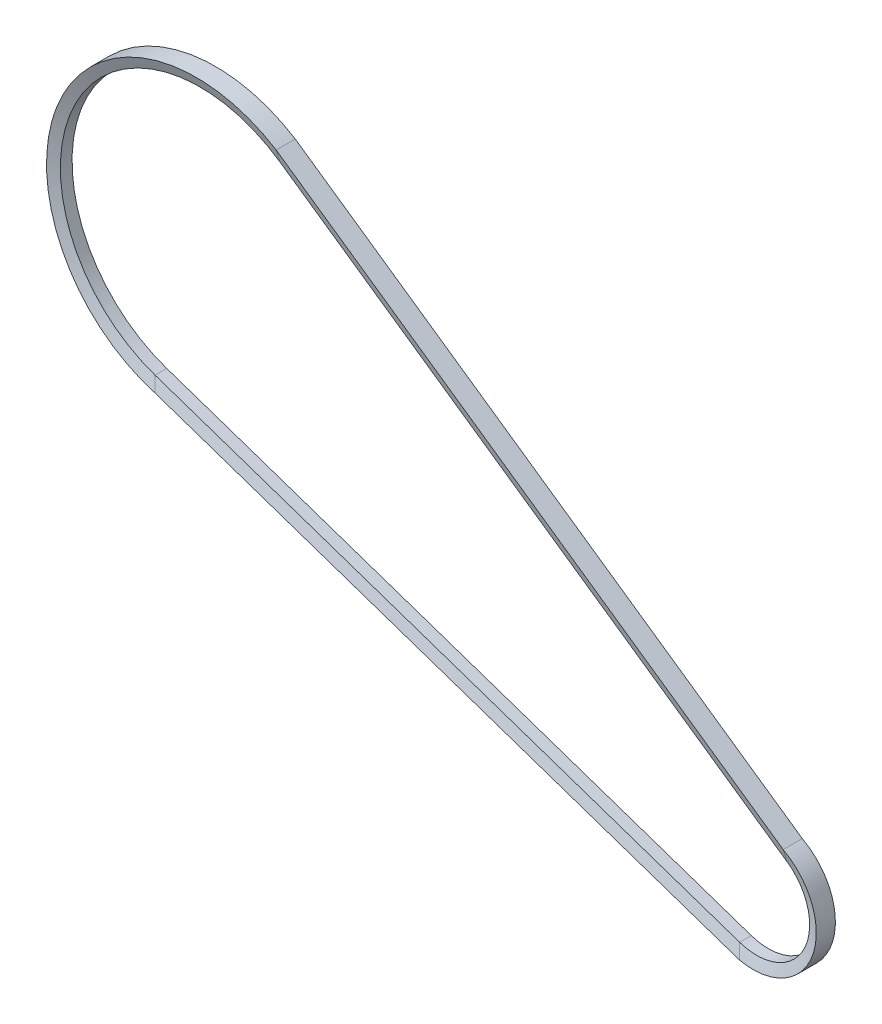
ISO-10303-21;
HEADER;
FILE_DESCRIPTION(('STEP AP214'),'2;1');
FILE_NAME('part.step','',(''),(''),'','','');
FILE_SCHEMA(('AUTOMOTIVE_DESIGN { 1 0 10303 214 1 1 1 1 }'));
ENDSEC;
DATA;
#1=APPLICATION_CONTEXT('core data for automotive mechanical design processes');
#2=APPLICATION_PROTOCOL_DEFINITION('international standard','automotive_design',2000,#1);
#3=PRODUCT_CONTEXT('',#1,'mechanical');
#4=PRODUCT('Part','Part','',(#3));
#5=PRODUCT_RELATED_PRODUCT_CATEGORY('part','',(#4));
#6=PRODUCT_DEFINITION_FORMATION('','',#4);
#7=PRODUCT_DEFINITION_CONTEXT('part definition',#1,'design');
#8=PRODUCT_DEFINITION('design','',#6,#7);
#9=PRODUCT_DEFINITION_SHAPE('','',#8);
#10=(LENGTH_UNIT() NAMED_UNIT(*) SI_UNIT(.MILLI.,.METRE.));
#11=(NAMED_UNIT(*) PLANE_ANGLE_UNIT() SI_UNIT($,.RADIAN.));
#12=(NAMED_UNIT(*) SI_UNIT($,.STERADIAN.) SOLID_ANGLE_UNIT());
#13=UNCERTAINTY_MEASURE_WITH_UNIT(LENGTH_MEASURE(1.E-05),#10,'distance_accuracy_value','');
#14=(GEOMETRIC_REPRESENTATION_CONTEXT(3) GLOBAL_UNCERTAINTY_ASSIGNED_CONTEXT((#13)) GLOBAL_UNIT_ASSIGNED_CONTEXT((#10,
#11,#12)) REPRESENTATION_CONTEXT('',''));
#15=CARTESIAN_POINT('',(0.,0.,0.));
#16=DIRECTION('',(0.,0.,1.));
#17=DIRECTION('',(1.,0.,0.));
#18=AXIS2_PLACEMENT_3D('',#15,#16,#17);
#19=CARTESIAN_POINT('',(1.20237153566904E-09,-7.0921046813055E-10,0.));
#20=DIRECTION('',(0.,0.,-1.));
#21=DIRECTION('',(-1.,0.,0.));
#22=AXIS2_PLACEMENT_3D('',#19,#20,#21);
#23=CYLINDRICAL_SURFACE('',#22,172.680901298834);
#24=CARTESIAN_POINT('',(1.20237153566904E-09,-7.0921046813055E-10,-11.));
#25=DIRECTION('',(0.,0.,-1.));
#26=DIRECTION('',(-0.277978977666814,-0.960587157927542,0.));
#27=AXIS2_PLACEMENT_3D('',#24,#25,#26);
#28=CIRCLE('',#27,172.680901298834);
#29=CARTESIAN_POINT('',(-48.0016604044897,-165.875056207894,-11.));
#30=VERTEX_POINT('',#29);
#31=CARTESIAN_POINT('',(91.8760151979489,146.21043569063,-11.));
#32=VERTEX_POINT('',#31);
#33=EDGE_CURVE('E11',#30,#32,#28,.T.);
#34=ORIENTED_EDGE('',*,*,#33,.F.);
#35=DIRECTION('',(0.,0.,1.));
#36=VECTOR('',#35,1.);
#37=CARTESIAN_POINT('',(-48.0016604044317,-165.875056207723,-11.));
#38=LINE('',#37,#36);
#39=CARTESIAN_POINT('',(-48.0016604044897,-165.875056207894,11.));
#40=VERTEX_POINT('',#39);
#41=EDGE_CURVE('E42',#30,#40,#38,.T.);
#42=ORIENTED_EDGE('',*,*,#41,.T.);
#43=CARTESIAN_POINT('',(1.20237153566904E-09,-7.0921046813055E-10,11.));
#44=DIRECTION('',(0.,0.,-1.));
#45=DIRECTION('',(-0.277978977666814,-0.960587157927542,0.));
#46=AXIS2_PLACEMENT_3D('',#43,#44,#45);
#47=CIRCLE('',#46,172.680901298834);
#48=CARTESIAN_POINT('',(91.8760151979489,146.21043569063,11.));
#49=VERTEX_POINT('',#48);
#50=EDGE_CURVE('E124',#40,#49,#47,.T.);
#51=ORIENTED_EDGE('',*,*,#50,.T.);
#52=DIRECTION('',(0.,0.,1.));
#53=VECTOR('',#52,1.);
#54=CARTESIAN_POINT('',(91.8760151979489,146.21043569063,-11.));
#55=LINE('',#54,#53);
#56=EDGE_CURVE('E127',#32,#49,#55,.T.);
#57=ORIENTED_EDGE('',*,*,#56,.F.);
#58=EDGE_LOOP('',(#34,#42,#51,#57));
#59=FACE_BOUND('',#58,.T.);
#60=ADVANCED_FACE('F39',(#59),#23,.T.);
#61=CARTESIAN_POINT('',(-51.8615264868886,-152.418443997054,-6.72));
#62=CARTESIAN_POINT('',(-151.368037812326,-118.560602140557,-6.72));
#63=CARTESIAN_POINT('',(-191.095266275028,-21.2484930789851,-6.72));
#64=CARTESIAN_POINT('',(-143.714287609072,72.5755023166236,-6.72));
#65=CARTESIAN_POINT('',(-96.3333089431168,166.399497712232,-6.72));
#66=CARTESIAN_POINT('',(5.56182919919446,192.192521464756,-6.72));
#67=CARTESIAN_POINT('',(91.8760152001114,132.211186481796,-6.72));
#68=CARTESIAN_POINT('',(-48.0016604044317,-165.875056207723,-11.));
#69=CARTESIAN_POINT('',(-156.293332503292,-134.537131219409,-11.));
#70=CARTESIAN_POINT('',(-203.685844075398,-32.2478275976319,-11.));
#71=CARTESIAN_POINT('',(-157.577213818633,70.6265910125611,-11.));
#72=CARTESIAN_POINT('',(-111.468583561867,173.501009622754,-11.));
#73=CARTESIAN_POINT('',(-3.57759260075846,206.191770671868,-11.));
#74=CARTESIAN_POINT('',(91.8760152001114,146.210435688908,-11.));
#75=(BOUNDED_SURFACE() B_SPLINE_SURFACE(1,3,((#61,#62,#63,#64,#65,#66,#67),(#68,#69,#70,#71,#72,
#73,#74)),.UNSPECIFIED.,.F.,.F.,.F.) B_SPLINE_SURFACE_WITH_KNOTS((2,2),(4,3,4),(0.,1.),(0.,0.5,
1.),.UNSPECIFIED.) GEOMETRIC_REPRESENTATION_ITEM() RATIONAL_B_SPLINE_SURFACE(((1.,
0.77069526935344,0.77069526935344,1.,0.77069526935344,0.77069526935344,1.),(1.,0.77069526935344,
0.77069526935344,1.,0.77069526935344,0.77069526935344,1.))) REPRESENTATION_ITEM('') SURFACE());
#76=CARTESIAN_POINT('',(1.20237153566904E-09,-7.0921046813055E-10,-6.72));
#77=DIRECTION('',(0.,0.,-1.));
#78=DIRECTION('',(-0.322121282535088,-0.946698409916247,0.));
#79=AXIS2_PLACEMENT_3D('',#76,#77,#78);
#80=CIRCLE('',#79,160.99999999982);
#81=CARTESIAN_POINT('',(-51.8615264869466,-152.418443997225,-6.72));
#82=VERTEX_POINT('',#81);
#83=CARTESIAN_POINT('',(91.8760151979489,132.211186483518,-6.72));
#84=VERTEX_POINT('',#83);
#85=EDGE_CURVE('E47',#82,#84,#80,.T.);
#86=DIRECTION('',(0.263671875357343,-0.919236600893949,-0.292371704722741));
#87=VECTOR('',#86,1.);
#88=CARTESIAN_POINT('',(-51.8615264868887,-152.418443997054,-6.72));
#89=LINE('',#88,#87);
#90=EDGE_CURVE('E193',#82,#30,#89,.T.);
#91=DIRECTION('',(0.,0.956304755963034,-0.292371704722741));
#92=VECTOR('',#91,1.);
#93=CARTESIAN_POINT('',(91.8760151979489,132.211186483518,-6.72));
#94=LINE('',#93,#92);
#95=EDGE_CURVE('E152',#84,#32,#94,.T.);
#96=ORIENTED_EDGE('',*,*,#85,.F.);
#97=ORIENTED_EDGE('',*,*,#90,.T.);
#98=ORIENTED_EDGE('',*,*,#33,.T.);
#99=ORIENTED_EDGE('',*,*,#95,.F.);
#100=EDGE_LOOP('',(#96,#97,#98,#99));
#101=FACE_BOUND('',#100,.T.);
#102=ADVANCED_FACE('F233',(#101),#75,.T.);
#103=CARTESIAN_POINT('',(1.20237153566904E-09,-7.0921046813055E-10,0.));
#104=DIRECTION('',(0.,0.,-1.));
#105=DIRECTION('',(-1.,0.,0.));
#106=AXIS2_PLACEMENT_3D('',#103,#104,#105);
#107=CYLINDRICAL_SURFACE('',#106,160.99999999982);
#108=CARTESIAN_POINT('',(1.20237153566904E-09,-7.0921046813055E-10,6.72));
#109=DIRECTION('',(0.,0.,-1.));
#110=DIRECTION('',(-0.322121282535088,-0.946698409916247,0.));
#111=AXIS2_PLACEMENT_3D('',#108,#109,#110);
#112=CIRCLE('',#111,160.99999999982);
#113=CARTESIAN_POINT('',(-51.8615264869466,-152.418443997225,6.72));
#114=VERTEX_POINT('',#113);
#115=CARTESIAN_POINT('',(91.8760151979489,132.211186483518,6.72));
#116=VERTEX_POINT('',#115);
#117=EDGE_CURVE('E133',#114,#116,#112,.T.);
#118=ORIENTED_EDGE('',*,*,#117,.F.);
#119=DIRECTION('',(0.,0.,-1.));
#120=VECTOR('',#119,1.);
#121=CARTESIAN_POINT('',(-51.8615264868887,-152.418443997054,6.72));
#122=LINE('',#121,#120);
#123=EDGE_CURVE('E177',#114,#82,#122,.T.);
#124=ORIENTED_EDGE('',*,*,#123,.T.);
#125=ORIENTED_EDGE('',*,*,#85,.T.);
#126=DIRECTION('',(0.,0.,-1.));
#127=VECTOR('',#126,1.);
#128=CARTESIAN_POINT('',(91.8760151979489,132.211186483518,6.72));
#129=LINE('',#128,#127);
#130=EDGE_CURVE('E157',#116,#84,#129,.T.);
#131=ORIENTED_EDGE('',*,*,#130,.F.);
#132=EDGE_LOOP('',(#118,#124,#125,#131));
#133=FACE_BOUND('',#132,.T.);
#134=ADVANCED_FACE('F229',(#133),#107,.F.);
#135=CARTESIAN_POINT('',(625.400467857975,-395.005215225236,-11.));
#136=DIRECTION('',(-0.322121282518866,-0.946698409921766,0.));
#137=DIRECTION('',(0.946698409921767,-0.322121282518866,0.));
#138=AXIS2_PLACEMENT_3D('',#135,#136,#137);
#139=PLANE('',#138);
#140=ORIENTED_EDGE('',*,*,#41,.F.);
#141=DIRECTION('',(-0.946698409921766,0.322121282518866,0.));
#142=VECTOR('',#141,1.);
#143=CARTESIAN_POINT('',(625.400467857975,-395.005215225236,-11.));
#144=LINE('',#143,#142);
#145=CARTESIAN_POINT('',(625.400467857975,-395.005215225236,-11.));
#146=VERTEX_POINT('',#145);
#147=EDGE_CURVE('E55',#146,#30,#144,.T.);
#148=ORIENTED_EDGE('',*,*,#147,.F.);
#149=DIRECTION('',(0.,0.,1.));
#150=VECTOR('',#149,1.);
#151=CARTESIAN_POINT('',(625.400467857975,-395.005215225236,-11.));
#152=LINE('',#151,#150);
#153=CARTESIAN_POINT('',(625.400467857975,-395.005215225236,11.));
#154=VERTEX_POINT('',#153);
#155=EDGE_CURVE('E181',#146,#154,#152,.T.);
#156=ORIENTED_EDGE('',*,*,#155,.T.);
#157=DIRECTION('',(-0.946698409921766,0.322121282518866,0.));
#158=VECTOR('',#157,1.);
#159=CARTESIAN_POINT('',(625.400467857975,-395.005215225236,11.));
#160=LINE('',#159,#158);
#161=EDGE_CURVE('E179',#154,#40,#160,.T.);
#162=ORIENTED_EDGE('',*,*,#161,.T.);
#163=EDGE_LOOP('',(#140,#148,#156,#162));
#164=FACE_BOUND('',#163,.T.);
#165=ADVANCED_FACE('F208',(#164),#139,.T.);
#166=CARTESIAN_POINT('',(621.540601775518,-381.548603014567,-6.72));
#167=DIRECTION('',(0.112390264031447,0.330309389734367,-0.937157476416985));
#168=DIRECTION('',(0.,0.943133032697069,0.332415527067598));
#169=AXIS2_PLACEMENT_3D('',#166,#167,#168);
#170=PLANE('',#169);
#171=ORIENTED_EDGE('',*,*,#147,.T.);
#172=ORIENTED_EDGE('',*,*,#90,.F.);
#173=DIRECTION('',(-0.946698409921766,0.322121282518866,0.));
#174=VECTOR('',#173,1.);
#175=CARTESIAN_POINT('',(621.540601775518,-381.548603014567,-6.72));
#176=LINE('',#175,#174);
#177=CARTESIAN_POINT('',(621.540601775518,-381.548603014567,-6.72));
#178=VERTEX_POINT('',#177);
#179=EDGE_CURVE('E64',#178,#82,#176,.T.);
#180=ORIENTED_EDGE('',*,*,#179,.F.);
#181=DIRECTION('',(0.263671875357343,-0.919236600893949,-0.292371704722741));
#182=VECTOR('',#181,1.);
#183=CARTESIAN_POINT('',(621.540601775518,-381.548603014567,-6.72));
#184=LINE('',#183,#182);
#185=EDGE_CURVE('E190',#178,#146,#184,.T.);
#186=ORIENTED_EDGE('',*,*,#185,.T.);
#187=EDGE_LOOP('',(#171,#172,#180,#186));
#188=FACE_BOUND('',#187,.T.);
#189=ADVANCED_FACE('F219',(#188),#170,.T.);
#190=CARTESIAN_POINT('',(621.540601775518,-381.548603014567,6.72));
#191=DIRECTION('',(0.322121282518866,0.946698409921766,0.));
#192=DIRECTION('',(-0.946698409921767,0.322121282518866,0.));
#193=AXIS2_PLACEMENT_3D('',#190,#191,#192);
#194=PLANE('',#193);
#195=ORIENTED_EDGE('',*,*,#179,.T.);
#196=ORIENTED_EDGE('',*,*,#123,.F.);
#197=DIRECTION('',(-0.946698409921766,0.322121282518866,0.));
#198=VECTOR('',#197,1.);
#199=CARTESIAN_POINT('',(621.540601775518,-381.548603014567,6.72));
#200=LINE('',#199,#198);
#201=CARTESIAN_POINT('',(621.540601775518,-381.548603014567,6.72));
#202=VERTEX_POINT('',#201);
#203=EDGE_CURVE('E92',#202,#114,#200,.T.);
#204=ORIENTED_EDGE('',*,*,#203,.F.);
#205=DIRECTION('',(0.,0.,-1.));
#206=VECTOR('',#205,1.);
#207=CARTESIAN_POINT('',(621.540601775518,-381.548603014567,6.72));
#208=LINE('',#207,#206);
#209=EDGE_CURVE('E171',#202,#178,#208,.T.);
#210=ORIENTED_EDGE('',*,*,#209,.T.);
#211=EDGE_LOOP('',(#195,#196,#204,#210));
#212=FACE_BOUND('',#211,.T.);
#213=ADVANCED_FACE('F221',(#212),#194,.T.);
#214=CARTESIAN_POINT('',(625.400467857975,-395.005215225236,11.));
#215=DIRECTION('',(0.112390264031447,0.330309389734368,0.937157476416985));
#216=DIRECTION('',(0.,-0.943133032697069,0.332415527067598));
#217=AXIS2_PLACEMENT_3D('',#214,#215,#216);
#218=PLANE('',#217);
#219=ORIENTED_EDGE('',*,*,#203,.T.);
#220=DIRECTION('',(-0.263671875357343,0.919236600893948,-0.292371704722741));
#221=VECTOR('',#220,1.);
#222=CARTESIAN_POINT('',(-48.0016604044317,-165.875056207723,11.));
#223=LINE('',#222,#221);
#224=EDGE_CURVE('E175',#40,#114,#223,.T.);
#225=ORIENTED_EDGE('',*,*,#224,.F.);
#226=ORIENTED_EDGE('',*,*,#161,.F.);
#227=DIRECTION('',(-0.263671875357342,0.919236600893948,-0.292371704722741));
#228=VECTOR('',#227,1.);
#229=CARTESIAN_POINT('',(625.400467857975,-395.005215225236,11.));
#230=LINE('',#229,#228);
#231=EDGE_CURVE('E166',#154,#202,#230,.T.);
#232=ORIENTED_EDGE('',*,*,#231,.T.);
#233=EDGE_LOOP('',(#219,#225,#226,#232));
#234=FACE_BOUND('',#233,.T.);
#235=ADVANCED_FACE('F227',(#234),#218,.T.);
#236=CARTESIAN_POINT('',(641.190000009169,-323.800000009339,0.));
#237=DIRECTION('',(0.,0.,-1.));
#238=DIRECTION('',(-1.,0.,0.));
#239=AXIS2_PLACEMENT_3D('',#236,#237,#238);
#240=CYLINDRICAL_SURFACE('',#239,72.934847634692);
#241=ORIENTED_EDGE('',*,*,#155,.F.);
#242=CARTESIAN_POINT('',(641.190000009169,-323.800000009339,-11.));
#243=DIRECTION('',(0.,0.,-1.));
#244=DIRECTION('',(0.477277575498753,0.878752590850253,0.));
#245=AXIS2_PLACEMENT_3D('',#242,#243,#244);
#246=CIRCLE('',#245,72.934847634692);
#247=CARTESIAN_POINT('',(676.000167257626,-259.708313687085,-11.));
#248=VERTEX_POINT('',#247);
#249=EDGE_CURVE('E200',#248,#146,#246,.T.);
#250=ORIENTED_EDGE('',*,*,#249,.F.);
#251=DIRECTION('',(0.,0.,1.));
#252=VECTOR('',#251,1.);
#253=CARTESIAN_POINT('',(676.000167257626,-259.708313687085,-11.));
#254=LINE('',#253,#252);
#255=CARTESIAN_POINT('',(676.000167257626,-259.708313687085,11.));
#256=VERTEX_POINT('',#255);
#257=EDGE_CURVE('E174',#248,#256,#254,.T.);
#258=ORIENTED_EDGE('',*,*,#257,.T.);
#259=CARTESIAN_POINT('',(641.190000009169,-323.800000009339,11.));
#260=DIRECTION('',(0.,0.,-1.));
#261=DIRECTION('',(0.477277575498753,0.878752590850253,0.));
#262=AXIS2_PLACEMENT_3D('',#259,#260,#261);
#263=CIRCLE('',#262,72.934847634692);
#264=EDGE_CURVE('E169',#256,#154,#263,.T.);
#265=ORIENTED_EDGE('',*,*,#264,.T.);
#266=EDGE_LOOP('',(#241,#250,#258,#265));
#267=FACE_BOUND('',#266,.T.);
#268=ADVANCED_FACE('F213',(#267),#240,.T.);
#269=CARTESIAN_POINT('',(676.000167257626,-273.707562894197,-6.72));
#270=CARTESIAN_POINT('',(753.602555687789,-327.634907533556,-6.72));
#271=CARTESIAN_POINT('',(711.003797814672,-411.989131005683,-6.72));
#272=CARTESIAN_POINT('',(621.540601775518,-381.548603014567,-6.72));
#273=CARTESIAN_POINT('',(676.000167257626,-259.708313687085,-11.));
#274=CARTESIAN_POINT('',(775.289964751233,-313.635658326444,-11.));
#275=CARTESIAN_POINT('',(735.710428555955,-419.466101492578,-11.));
#276=CARTESIAN_POINT('',(625.400467857975,-395.005215225236,-11.));
#277=(BOUNDED_SURFACE() B_SPLINE_SURFACE(1,3,((#269,#270,#271,#272),(#273,#274,#275,#276)),
.UNSPECIFIED.,.F.,.F.,.F.) B_SPLINE_SURFACE_WITH_KNOTS((2,2),(4,4),(0.,1.),(0.,1.),
.UNSPECIFIED.) GEOMETRIC_REPRESENTATION_ITEM() RATIONAL_B_SPLINE_SURFACE(((1.,0.426143610762231,
0.426143610762231,1.),(1.,0.426143610762231,0.426143610762231,1.))) REPRESENTATION_ITEM('') SURFACE());
#278=CARTESIAN_POINT('',(641.190000009169,-323.800000009339,-6.72));
#279=DIRECTION('',(0.,0.,-1.));
#280=DIRECTION('',(0.570658479482897,0.821187493690855,0.));
#281=AXIS2_PLACEMENT_3D('',#278,#279,#280);
#282=CIRCLE('',#281,61.);
#283=CARTESIAN_POINT('',(676.000167257626,-273.707562894197,-6.72));
#284=VERTEX_POINT('',#283);
#285=EDGE_CURVE('E105',#284,#178,#282,.T.);
#286=DIRECTION('',(0.,0.956304755963034,-0.292371704722741));
#287=VECTOR('',#286,1.);
#288=CARTESIAN_POINT('',(676.000167257626,-273.707562894197,-6.72));
#289=LINE('',#288,#287);
#290=EDGE_CURVE('E187',#284,#248,#289,.T.);
#291=ORIENTED_EDGE('',*,*,#249,.T.);
#292=ORIENTED_EDGE('',*,*,#185,.F.);
#293=ORIENTED_EDGE('',*,*,#285,.F.);
#294=ORIENTED_EDGE('',*,*,#290,.T.);
#295=EDGE_LOOP('',(#291,#292,#293,#294));
#296=FACE_BOUND('',#295,.T.);
#297=ADVANCED_FACE('F218',(#296),#277,.T.);
#298=CARTESIAN_POINT('',(641.190000009169,-323.800000009339,0.));
#299=DIRECTION('',(0.,0.,-1.));
#300=DIRECTION('',(-1.,0.,0.));
#301=AXIS2_PLACEMENT_3D('',#298,#299,#300);
#302=CYLINDRICAL_SURFACE('',#301,61.);
#303=ORIENTED_EDGE('',*,*,#285,.T.);
#304=ORIENTED_EDGE('',*,*,#209,.F.);
#305=CARTESIAN_POINT('',(641.190000009169,-323.800000009339,6.72));
#306=DIRECTION('',(0.,0.,-1.));
#307=DIRECTION('',(0.570658479482897,0.821187493690855,0.));
#308=AXIS2_PLACEMENT_3D('',#305,#306,#307);
#309=CIRCLE('',#308,61.);
#310=CARTESIAN_POINT('',(676.000167257626,-273.707562894197,6.72));
#311=VERTEX_POINT('',#310);
#312=EDGE_CURVE('E111',#311,#202,#309,.T.);
#313=ORIENTED_EDGE('',*,*,#312,.F.);
#314=DIRECTION('',(0.,0.,-1.));
#315=VECTOR('',#314,1.);
#316=CARTESIAN_POINT('',(676.000167257626,-273.707562894197,6.72));
#317=LINE('',#316,#315);
#318=EDGE_CURVE('E164',#311,#284,#317,.T.);
#319=ORIENTED_EDGE('',*,*,#318,.T.);
#320=EDGE_LOOP('',(#303,#304,#313,#319));
#321=FACE_BOUND('',#320,.T.);
#322=ADVANCED_FACE('F258',(#321),#302,.F.);
#323=CARTESIAN_POINT('',(676.000167257626,-259.708313687085,11.));
#324=CARTESIAN_POINT('',(775.289964751233,-313.635658326444,11.));
#325=CARTESIAN_POINT('',(735.710428555955,-419.466101492578,11.));
#326=CARTESIAN_POINT('',(625.400467857975,-395.005215225236,11.));
#327=CARTESIAN_POINT('',(676.000167257626,-273.707562894197,6.72));
#328=CARTESIAN_POINT('',(753.602555687789,-327.634907533556,6.72));
#329=CARTESIAN_POINT('',(711.003797814672,-411.989131005683,6.72));
#330=CARTESIAN_POINT('',(621.540601775518,-381.548603014567,6.72));
#331=(BOUNDED_SURFACE() B_SPLINE_SURFACE(1,3,((#323,#324,#325,#326),(#327,#328,#329,#330)),
.UNSPECIFIED.,.F.,.F.,.F.) B_SPLINE_SURFACE_WITH_KNOTS((2,2),(4,4),(0.,1.),(0.,1.),
.UNSPECIFIED.) GEOMETRIC_REPRESENTATION_ITEM() RATIONAL_B_SPLINE_SURFACE(((1.,0.426143610762231,
0.426143610762231,1.),(1.,0.426143610762231,0.426143610762231,1.))) REPRESENTATION_ITEM('') SURFACE());
#332=DIRECTION('',(0.,-0.956304755963034,-0.292371704722741));
#333=VECTOR('',#332,1.);
#334=CARTESIAN_POINT('',(676.000167257626,-259.708313687085,11.));
#335=LINE('',#334,#333);
#336=EDGE_CURVE('E144',#256,#311,#335,.T.);
#337=ORIENTED_EDGE('',*,*,#312,.T.);
#338=ORIENTED_EDGE('',*,*,#231,.F.);
#339=ORIENTED_EDGE('',*,*,#264,.F.);
#340=ORIENTED_EDGE('',*,*,#336,.T.);
#341=EDGE_LOOP('',(#337,#338,#339,#340));
#342=FACE_BOUND('',#341,.T.);
#343=ADVANCED_FACE('F211',(#342),#331,.T.);
#344=CARTESIAN_POINT('',(91.8760151979489,146.21043569063,-11.));
#345=DIRECTION('',(0.570658479482897,0.821187493690855,0.));
#346=DIRECTION('',(-0.821187493690855,0.570658479482897,0.));
#347=AXIS2_PLACEMENT_3D('',#344,#345,#346);
#348=PLANE('',#347);
#349=ORIENTED_EDGE('',*,*,#257,.F.);
#350=DIRECTION('',(0.821187493690855,-0.570658479482897,0.));
#351=VECTOR('',#350,1.);
#352=CARTESIAN_POINT('',(91.8760151979489,146.21043569063,-11.));
#353=LINE('',#352,#351);
#354=EDGE_CURVE('E151',#32,#248,#353,.T.);
#355=ORIENTED_EDGE('',*,*,#354,.F.);
#356=ORIENTED_EDGE('',*,*,#56,.T.);
#357=DIRECTION('',(0.821187493690855,-0.570658479482897,0.));
#358=VECTOR('',#357,1.);
#359=CARTESIAN_POINT('',(91.8760151979489,146.21043569063,11.));
#360=LINE('',#359,#358);
#361=EDGE_CURVE('E139',#49,#256,#360,.T.);
#362=ORIENTED_EDGE('',*,*,#361,.T.);
#363=EDGE_LOOP('',(#349,#355,#356,#362));
#364=FACE_BOUND('',#363,.T.);
#365=ADVANCED_FACE('F149',(#364),#348,.T.);
#366=CARTESIAN_POINT('',(91.8760151979489,132.211186483518,-6.72));
#367=DIRECTION('',(-0.199106549804298,-0.286517793899047,-0.937157476416985));
#368=DIRECTION('',(0.,0.956304755963034,-0.292371704722741));
#369=AXIS2_PLACEMENT_3D('',#366,#367,#368);
#370=PLANE('',#369);
#371=ORIENTED_EDGE('',*,*,#354,.T.);
#372=ORIENTED_EDGE('',*,*,#290,.F.);
#373=DIRECTION('',(0.821187493690855,-0.570658479482897,0.));
#374=VECTOR('',#373,1.);
#375=CARTESIAN_POINT('',(91.8760151979489,132.211186483518,-6.72));
#376=LINE('',#375,#374);
#377=EDGE_CURVE('E184',#84,#284,#376,.T.);
#378=ORIENTED_EDGE('',*,*,#377,.F.);
#379=ORIENTED_EDGE('',*,*,#95,.T.);
#380=EDGE_LOOP('',(#371,#372,#378,#379));
#381=FACE_BOUND('',#380,.T.);
#382=ADVANCED_FACE('F215',(#381),#370,.T.);
#383=CARTESIAN_POINT('',(91.8760151979489,132.211186483518,6.72));
#384=DIRECTION('',(-0.570658479482897,-0.821187493690855,0.));
#385=DIRECTION('',(0.821187493690855,-0.570658479482897,0.));
#386=AXIS2_PLACEMENT_3D('',#383,#384,#385);
#387=PLANE('',#386);
#388=ORIENTED_EDGE('',*,*,#377,.T.);
#389=ORIENTED_EDGE('',*,*,#318,.F.);
#390=DIRECTION('',(0.821187493690855,-0.570658479482897,0.));
#391=VECTOR('',#390,1.);
#392=CARTESIAN_POINT('',(91.8760151979489,132.211186483518,6.72));
#393=LINE('',#392,#391);
#394=EDGE_CURVE('E163',#116,#311,#393,.T.);
#395=ORIENTED_EDGE('',*,*,#394,.F.);
#396=ORIENTED_EDGE('',*,*,#130,.T.);
#397=EDGE_LOOP('',(#388,#389,#395,#396));
#398=FACE_BOUND('',#397,.T.);
#399=ADVANCED_FACE('F271',(#398),#387,.T.);
#400=CARTESIAN_POINT('',(91.8760151979489,146.21043569063,11.));
#401=DIRECTION('',(-0.199106549804298,-0.286517793899048,0.937157476416985));
#402=DIRECTION('',(0.,-0.956304755963034,-0.292371704722741));
#403=AXIS2_PLACEMENT_3D('',#400,#401,#402);
#404=PLANE('',#403);
#405=ORIENTED_EDGE('',*,*,#394,.T.);
#406=ORIENTED_EDGE('',*,*,#336,.F.);
#407=ORIENTED_EDGE('',*,*,#361,.F.);
#408=DIRECTION('',(0.,-0.956304755963034,-0.292371704722741));
#409=VECTOR('',#408,1.);
#410=CARTESIAN_POINT('',(91.8760151979489,146.21043569063,11.));
#411=LINE('',#410,#409);
#412=EDGE_CURVE('E142',#49,#116,#411,.T.);
#413=ORIENTED_EDGE('',*,*,#412,.T.);
#414=EDGE_LOOP('',(#405,#406,#407,#413));
#415=FACE_BOUND('',#414,.T.);
#416=ADVANCED_FACE('F141',(#415),#404,.T.);
#417=CARTESIAN_POINT('',(-48.0016604044317,-165.875056207723,11.));
#418=CARTESIAN_POINT('',(-156.293332503292,-134.537131219409,11.));
#419=CARTESIAN_POINT('',(-203.685844075398,-32.2478275976319,11.));
#420=CARTESIAN_POINT('',(-157.577213818633,70.6265910125611,11.));
#421=CARTESIAN_POINT('',(-111.468583561867,173.501009622754,11.));
#422=CARTESIAN_POINT('',(-3.57759260075846,206.191770671868,11.));
#423=CARTESIAN_POINT('',(91.8760152001114,146.210435688908,11.));
#424=CARTESIAN_POINT('',(-51.8615264868886,-152.418443997054,6.72));
#425=CARTESIAN_POINT('',(-151.368037812326,-118.560602140557,6.72));
#426=CARTESIAN_POINT('',(-191.095266275028,-21.2484930789851,6.72));
#427=CARTESIAN_POINT('',(-143.714287609072,72.5755023166236,6.72));
#428=CARTESIAN_POINT('',(-96.3333089431168,166.399497712232,6.72));
#429=CARTESIAN_POINT('',(5.56182919919446,192.192521464756,6.72));
#430=CARTESIAN_POINT('',(91.8760152001114,132.211186481796,6.72));
#431=(BOUNDED_SURFACE() B_SPLINE_SURFACE(1,3,((#417,#418,#419,#420,#421,#422,#423),(#424,#425,
#426,#427,#428,#429,#430)),.UNSPECIFIED.,.F.,.F.,.F.) B_SPLINE_SURFACE_WITH_KNOTS((2,2),(4,3,4),
(0.,1.),(0.,0.5,1.),
.UNSPECIFIED.) GEOMETRIC_REPRESENTATION_ITEM() RATIONAL_B_SPLINE_SURFACE(((1.,0.77069526935344,
0.77069526935344,1.,0.77069526935344,0.77069526935344,1.),(1.,0.77069526935344,0.77069526935344,
1.,0.77069526935344,0.77069526935344,1.))) REPRESENTATION_ITEM('') SURFACE());
#432=ORIENTED_EDGE('',*,*,#224,.T.);
#433=ORIENTED_EDGE('',*,*,#117,.T.);
#434=ORIENTED_EDGE('',*,*,#412,.F.);
#435=ORIENTED_EDGE('',*,*,#50,.F.);
#436=EDGE_LOOP('',(#432,#433,#434,#435));
#437=FACE_BOUND('',#436,.T.);
#438=ADVANCED_FACE('F154',(#437),#431,.T.);
#439=CLOSED_SHELL('',(#60,#102,#134,#165,#189,#213,#235,#268,#297,#322,#343,#365,#382,#399,#416,#438));
#440=MANIFOLD_SOLID_BREP('B2',#439);
#441=ADVANCED_BREP_SHAPE_REPRESENTATION('',(#18,#440),#14);
#442=SHAPE_DEFINITION_REPRESENTATION(#9,#441);
ENDSEC;
END-ISO-10303-21;
